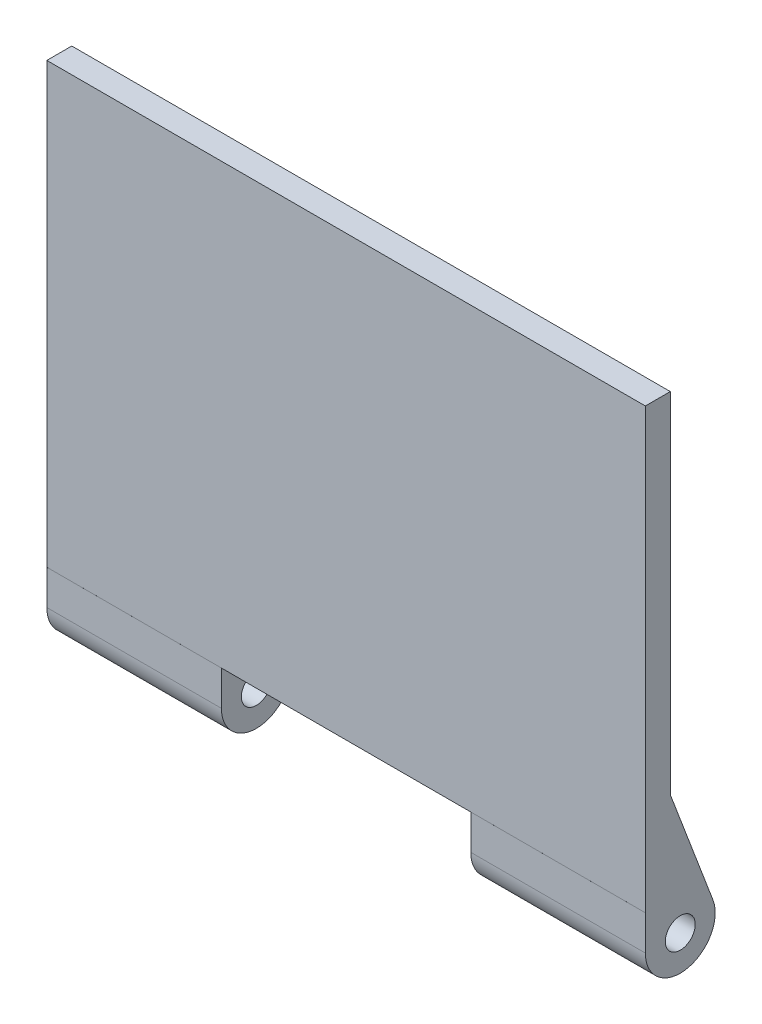
ISO-10303-21;
HEADER;
FILE_DESCRIPTION(('STEP AP214'),'2;1');
FILE_NAME('part.step','',(''),(''),'','','');
FILE_SCHEMA(('AUTOMOTIVE_DESIGN { 1 0 10303 214 1 1 1 1 }'));
ENDSEC;
DATA;
#1=APPLICATION_CONTEXT('core data for automotive mechanical design processes');
#2=APPLICATION_PROTOCOL_DEFINITION('international standard','automotive_design',2000,#1);
#3=PRODUCT_CONTEXT('',#1,'mechanical');
#4=PRODUCT('Part','Part','',(#3));
#5=PRODUCT_RELATED_PRODUCT_CATEGORY('part','',(#4));
#6=PRODUCT_DEFINITION_FORMATION('','',#4);
#7=PRODUCT_DEFINITION_CONTEXT('part definition',#1,'design');
#8=PRODUCT_DEFINITION('design','',#6,#7);
#9=PRODUCT_DEFINITION_SHAPE('','',#8);
#10=(LENGTH_UNIT() NAMED_UNIT(*) SI_UNIT(.MILLI.,.METRE.));
#11=(NAMED_UNIT(*) PLANE_ANGLE_UNIT() SI_UNIT($,.RADIAN.));
#12=(NAMED_UNIT(*) SI_UNIT($,.STERADIAN.) SOLID_ANGLE_UNIT());
#13=UNCERTAINTY_MEASURE_WITH_UNIT(LENGTH_MEASURE(1.E-05),#10,'distance_accuracy_value','');
#14=(GEOMETRIC_REPRESENTATION_CONTEXT(3) GLOBAL_UNCERTAINTY_ASSIGNED_CONTEXT((#13)) GLOBAL_UNIT_ASSIGNED_CONTEXT((#10,
#11,#12)) REPRESENTATION_CONTEXT('',''));
#15=CARTESIAN_POINT('',(0.,0.,0.));
#16=DIRECTION('',(0.,0.,1.));
#17=DIRECTION('',(1.,0.,0.));
#18=AXIS2_PLACEMENT_3D('',#15,#16,#17);
#19=CARTESIAN_POINT('',(-30.,-22.,2.5));
#20=DIRECTION('',(0.,1.,0.));
#21=DIRECTION('',(0.,0.,1.));
#22=AXIS2_PLACEMENT_3D('',#19,#20,#21);
#23=PLANE('',#22);
#24=DIRECTION('',(0.,0.,-1.));
#25=VECTOR('',#24,1.);
#26=CARTESIAN_POINT('',(-12.5,-22.,2.50055162199684));
#27=LINE('',#26,#25);
#28=CARTESIAN_POINT('',(-12.5,-22.,2.5));
#29=VERTEX_POINT('',#28);
#30=CARTESIAN_POINT('',(-12.5,-22.,0.));
#31=VERTEX_POINT('',#30);
#32=EDGE_CURVE('E202',#29,#31,#27,.T.);
#33=ORIENTED_EDGE('',*,*,#32,.T.);
#34=DIRECTION('',(1.,0.,0.));
#35=VECTOR('',#34,1.);
#36=CARTESIAN_POINT('',(-30.,-22.,0.));
#37=LINE('',#36,#35);
#38=CARTESIAN_POINT('',(12.5,-22.,0.));
#39=VERTEX_POINT('',#38);
#40=EDGE_CURVE('E103',#31,#39,#37,.T.);
#41=ORIENTED_EDGE('',*,*,#40,.T.);
#42=DIRECTION('',(0.,0.,1.));
#43=VECTOR('',#42,1.);
#44=CARTESIAN_POINT('',(12.5,-22.,0.));
#45=LINE('',#44,#43);
#46=CARTESIAN_POINT('',(12.5,-22.,2.5));
#47=VERTEX_POINT('',#46);
#48=EDGE_CURVE('E172',#39,#47,#45,.T.);
#49=ORIENTED_EDGE('',*,*,#48,.T.);
#50=DIRECTION('',(1.,0.,0.));
#51=VECTOR('',#50,1.);
#52=CARTESIAN_POINT('',(-30.,-22.,2.5));
#53=LINE('',#52,#51);
#54=EDGE_CURVE('E116',#29,#47,#53,.T.);
#55=ORIENTED_EDGE('',*,*,#54,.F.);
#56=EDGE_LOOP('',(#33,#41,#49,#55));
#57=FACE_BOUND('',#56,.T.);
#58=ADVANCED_FACE('F39',(#57),#23,.F.);
#59=CARTESIAN_POINT('',(30.,-22.,2.5));
#60=DIRECTION('',(-1.,0.,0.));
#61=DIRECTION('',(0.,0.,1.));
#62=AXIS2_PLACEMENT_3D('',#59,#60,#61);
#63=PLANE('',#62);
#64=DIRECTION('',(0.,1.,0.));
#65=VECTOR('',#64,1.);
#66=CARTESIAN_POINT('',(30.,-22.,2.5));
#67=LINE('',#66,#65);
#68=CARTESIAN_POINT('',(30.,-22.,2.5));
#69=VERTEX_POINT('',#68);
#70=CARTESIAN_POINT('',(30.,22.,2.5));
#71=VERTEX_POINT('',#70);
#72=EDGE_CURVE('E107',#69,#71,#67,.T.);
#73=ORIENTED_EDGE('',*,*,#72,.F.);
#74=DIRECTION('',(0.,0.,1.));
#75=VECTOR('',#74,1.);
#76=CARTESIAN_POINT('',(30.,-22.,0.));
#77=LINE('',#76,#75);
#78=CARTESIAN_POINT('',(30.,-22.,2.50055162199684));
#79=VERTEX_POINT('',#78);
#80=EDGE_CURVE('E152',#69,#79,#77,.T.);
#81=ORIENTED_EDGE('',*,*,#80,.T.);
#82=DIRECTION('',(0.,-1.,0.));
#83=VECTOR('',#82,1.);
#84=CARTESIAN_POINT('',(30.,-22.,2.50055162199684));
#85=LINE('',#84,#83);
#86=CARTESIAN_POINT('',(30.,-25.5,2.50055162199684));
#87=VERTEX_POINT('',#86);
#88=EDGE_CURVE('E148',#79,#87,#85,.T.);
#89=ORIENTED_EDGE('',*,*,#88,.T.);
#90=CARTESIAN_POINT('',(30.,-25.5,-0.999448378003161));
#91=DIRECTION('',(1.,0.,0.));
#92=DIRECTION('',(0.,0.,-1.));
#93=AXIS2_PLACEMENT_3D('',#90,#91,#92);
#94=CIRCLE('',#93,3.5);
#95=CARTESIAN_POINT('',(30.,-24.2583558546698,-4.27180529869002));
#96=VERTEX_POINT('',#95);
#97=EDGE_CURVE('E145',#87,#96,#94,.T.);
#98=ORIENTED_EDGE('',*,*,#97,.T.);
#99=DIRECTION('',(0.,0.934959120196244,0.354755470094352));
#100=VECTOR('',#99,1.);
#101=CARTESIAN_POINT('',(30.,-13.,0.));
#102=LINE('',#101,#100);
#103=CARTESIAN_POINT('',(30.,-13.,0.));
#104=VERTEX_POINT('',#103);
#105=EDGE_CURVE('E55',#96,#104,#102,.T.);
#106=ORIENTED_EDGE('',*,*,#105,.T.);
#107=DIRECTION('',(0.,1.,0.));
#108=VECTOR('',#107,1.);
#109=CARTESIAN_POINT('',(30.,-22.,0.));
#110=LINE('',#109,#108);
#111=CARTESIAN_POINT('',(30.,22.,0.));
#112=VERTEX_POINT('',#111);
#113=EDGE_CURVE('E85',#104,#112,#110,.T.);
#114=ORIENTED_EDGE('',*,*,#113,.T.);
#115=DIRECTION('',(0.,0.,-1.));
#116=VECTOR('',#115,1.);
#117=CARTESIAN_POINT('',(30.,22.,2.5));
#118=LINE('',#117,#116);
#119=EDGE_CURVE('E11',#71,#112,#118,.T.);
#120=ORIENTED_EDGE('',*,*,#119,.F.);
#121=EDGE_LOOP('',(#73,#81,#89,#98,#106,#114,#120));
#122=FACE_BOUND('',#121,.T.);
#123=CARTESIAN_POINT('',(30.,-25.5,-0.999448378003161));
#124=DIRECTION('',(1.,0.,0.));
#125=DIRECTION('',(0.,0.,-1.));
#126=AXIS2_PLACEMENT_3D('',#123,#124,#125);
#127=CIRCLE('',#126,1.5);
#128=CARTESIAN_POINT('',(30.,-25.5,-2.49944837800316));
#129=VERTEX_POINT('',#128);
#130=EDGE_CURVE('E176',#129,#129,#127,.T.);
#131=ORIENTED_EDGE('',*,*,#130,.F.);
#132=EDGE_LOOP('',(#131));
#133=FACE_BOUND('',#132,.T.);
#134=ADVANCED_FACE('F41',(#122,#133),#63,.F.);
#135=CARTESIAN_POINT('',(-30.,22.,2.5));
#136=DIRECTION('',(0.,-1.,0.));
#137=DIRECTION('',(0.,0.,-1.));
#138=AXIS2_PLACEMENT_3D('',#135,#136,#137);
#139=PLANE('',#138);
#140=DIRECTION('',(-1.,0.,0.));
#141=VECTOR('',#140,1.);
#142=CARTESIAN_POINT('',(-30.,22.,0.));
#143=LINE('',#142,#141);
#144=CARTESIAN_POINT('',(-30.,22.,0.));
#145=VERTEX_POINT('',#144);
#146=EDGE_CURVE('E75',#112,#145,#143,.T.);
#147=ORIENTED_EDGE('',*,*,#146,.T.);
#148=DIRECTION('',(0.,0.,-1.));
#149=VECTOR('',#148,1.);
#150=CARTESIAN_POINT('',(-30.,22.,2.5));
#151=LINE('',#150,#149);
#152=CARTESIAN_POINT('',(-30.,22.,2.5));
#153=VERTEX_POINT('',#152);
#154=EDGE_CURVE('E48',#153,#145,#151,.T.);
#155=ORIENTED_EDGE('',*,*,#154,.F.);
#156=DIRECTION('',(-1.,0.,0.));
#157=VECTOR('',#156,1.);
#158=CARTESIAN_POINT('',(-30.,22.,2.5));
#159=LINE('',#158,#157);
#160=EDGE_CURVE('E64',#71,#153,#159,.T.);
#161=ORIENTED_EDGE('',*,*,#160,.F.);
#162=ORIENTED_EDGE('',*,*,#119,.T.);
#163=EDGE_LOOP('',(#147,#155,#161,#162));
#164=FACE_BOUND('',#163,.T.);
#165=ADVANCED_FACE('F77',(#164),#139,.F.);
#166=CARTESIAN_POINT('',(-30.,-22.,2.5));
#167=DIRECTION('',(1.,0.,0.));
#168=DIRECTION('',(0.,0.,-1.));
#169=AXIS2_PLACEMENT_3D('',#166,#167,#168);
#170=PLANE('',#169);
#171=DIRECTION('',(0.,-1.,0.));
#172=VECTOR('',#171,1.);
#173=CARTESIAN_POINT('',(-30.,-22.,0.));
#174=LINE('',#173,#172);
#175=CARTESIAN_POINT('',(-30.,-13.,0.));
#176=VERTEX_POINT('',#175);
#177=EDGE_CURVE('E84',#145,#176,#174,.T.);
#178=ORIENTED_EDGE('',*,*,#177,.T.);
#179=DIRECTION('',(0.,-0.934959120196244,-0.354755470094352));
#180=VECTOR('',#179,1.);
#181=CARTESIAN_POINT('',(-30.,-13.,0.));
#182=LINE('',#181,#180);
#183=CARTESIAN_POINT('',(-30.,-24.2583558546698,-4.27180529869002));
#184=VERTEX_POINT('',#183);
#185=EDGE_CURVE('E207',#176,#184,#182,.T.);
#186=ORIENTED_EDGE('',*,*,#185,.T.);
#187=CARTESIAN_POINT('',(-30.,-25.5,-0.999448378003161));
#188=DIRECTION('',(-1.,0.,0.));
#189=DIRECTION('',(0.,0.,1.));
#190=AXIS2_PLACEMENT_3D('',#187,#188,#189);
#191=CIRCLE('',#190,3.5);
#192=CARTESIAN_POINT('',(-30.,-25.5,2.50055162199684));
#193=VERTEX_POINT('',#192);
#194=EDGE_CURVE('E203',#184,#193,#191,.T.);
#195=ORIENTED_EDGE('',*,*,#194,.T.);
#196=DIRECTION('',(0.,1.,0.));
#197=VECTOR('',#196,1.);
#198=CARTESIAN_POINT('',(-30.,-25.5,2.50055162199684));
#199=LINE('',#198,#197);
#200=CARTESIAN_POINT('',(-30.,-22.,2.50055162199684));
#201=VERTEX_POINT('',#200);
#202=EDGE_CURVE('E198',#193,#201,#199,.T.);
#203=ORIENTED_EDGE('',*,*,#202,.T.);
#204=DIRECTION('',(0.,0.,-1.));
#205=VECTOR('',#204,1.);
#206=CARTESIAN_POINT('',(-30.,-22.,2.5));
#207=LINE('',#206,#205);
#208=CARTESIAN_POINT('',(-30.,-22.,2.5));
#209=VERTEX_POINT('',#208);
#210=EDGE_CURVE('E210',#201,#209,#207,.T.);
#211=ORIENTED_EDGE('',*,*,#210,.T.);
#212=DIRECTION('',(0.,-1.,0.));
#213=VECTOR('',#212,1.);
#214=CARTESIAN_POINT('',(-30.,-22.,2.5));
#215=LINE('',#214,#213);
#216=EDGE_CURVE('E94',#153,#209,#215,.T.);
#217=ORIENTED_EDGE('',*,*,#216,.F.);
#218=ORIENTED_EDGE('',*,*,#154,.T.);
#219=EDGE_LOOP('',(#178,#186,#195,#203,#211,#217,#218));
#220=FACE_BOUND('',#219,.T.);
#221=CARTESIAN_POINT('',(-30.,-25.5,-0.999448378003161));
#222=DIRECTION('',(-1.,0.,0.));
#223=DIRECTION('',(0.,0.,1.));
#224=AXIS2_PLACEMENT_3D('',#221,#222,#223);
#225=CIRCLE('',#224,1.5);
#226=CARTESIAN_POINT('',(-30.,-25.5,0.50055162199684));
#227=VERTEX_POINT('',#226);
#228=EDGE_CURVE('E232',#227,#227,#225,.T.);
#229=ORIENTED_EDGE('',*,*,#228,.F.);
#230=EDGE_LOOP('',(#229));
#231=FACE_BOUND('',#230,.T.);
#232=ADVANCED_FACE('F89',(#220,#231),#170,.F.);
#233=CARTESIAN_POINT('',(0.,0.,2.5));
#234=DIRECTION('',(0.,0.,-1.));
#235=DIRECTION('',(-1.,0.,0.));
#236=AXIS2_PLACEMENT_3D('',#233,#234,#235);
#237=PLANE('',#236);
#238=ORIENTED_EDGE('',*,*,#72,.T.);
#239=ORIENTED_EDGE('',*,*,#160,.T.);
#240=ORIENTED_EDGE('',*,*,#216,.T.);
#241=EDGE_CURVE('E96',#209,#29,#53,.T.);
#242=ORIENTED_EDGE('',*,*,#241,.T.);
#243=ORIENTED_EDGE('',*,*,#54,.T.);
#244=DIRECTION('',(1.,0.,0.));
#245=VECTOR('',#244,1.);
#246=CARTESIAN_POINT('',(0.,-22.,2.5));
#247=LINE('',#246,#245);
#248=EDGE_CURVE('E112',#47,#69,#247,.T.);
#249=ORIENTED_EDGE('',*,*,#248,.T.);
#250=EDGE_LOOP('',(#238,#239,#240,#242,#243,#249));
#251=FACE_BOUND('',#250,.T.);
#252=ADVANCED_FACE('F249',(#251),#237,.F.);
#253=CARTESIAN_POINT('',(0.,0.,0.));
#254=DIRECTION('',(0.,0.,-1.));
#255=DIRECTION('',(-1.,0.,0.));
#256=AXIS2_PLACEMENT_3D('',#253,#254,#255);
#257=PLANE('',#256);
#258=DIRECTION('',(-1.,0.,0.));
#259=VECTOR('',#258,1.);
#260=CARTESIAN_POINT('',(-12.5,-13.,0.));
#261=LINE('',#260,#259);
#262=CARTESIAN_POINT('',(-12.5,-13.,0.));
#263=VERTEX_POINT('',#262);
#264=EDGE_CURVE('E101',#263,#176,#261,.T.);
#265=ORIENTED_EDGE('',*,*,#264,.T.);
#266=ORIENTED_EDGE('',*,*,#177,.F.);
#267=ORIENTED_EDGE('',*,*,#146,.F.);
#268=ORIENTED_EDGE('',*,*,#113,.F.);
#269=DIRECTION('',(1.,0.,0.));
#270=VECTOR('',#269,1.);
#271=CARTESIAN_POINT('',(12.5,-13.,0.));
#272=LINE('',#271,#270);
#273=CARTESIAN_POINT('',(12.5,-13.,0.));
#274=VERTEX_POINT('',#273);
#275=EDGE_CURVE('E126',#274,#104,#272,.T.);
#276=ORIENTED_EDGE('',*,*,#275,.F.);
#277=DIRECTION('',(0.,-1.,0.));
#278=VECTOR('',#277,1.);
#279=CARTESIAN_POINT('',(12.5,-22.,0.));
#280=LINE('',#279,#278);
#281=EDGE_CURVE('E132',#274,#39,#280,.T.);
#282=ORIENTED_EDGE('',*,*,#281,.T.);
#283=ORIENTED_EDGE('',*,*,#40,.F.);
#284=DIRECTION('',(0.,1.,0.));
#285=VECTOR('',#284,1.);
#286=CARTESIAN_POINT('',(-12.5,-22.,0.));
#287=LINE('',#286,#285);
#288=EDGE_CURVE('E225',#31,#263,#287,.T.);
#289=ORIENTED_EDGE('',*,*,#288,.T.);
#290=EDGE_LOOP('',(#265,#266,#267,#268,#276,#282,#283,#289));
#291=FACE_BOUND('',#290,.T.);
#292=ADVANCED_FACE('F98',(#291),#257,.T.);
#293=CARTESIAN_POINT('',(12.5,-22.,0.));
#294=DIRECTION('',(0.,1.,0.));
#295=DIRECTION('',(0.,0.,1.));
#296=AXIS2_PLACEMENT_3D('',#293,#294,#295);
#297=PLANE('',#296);
#298=ORIENTED_EDGE('',*,*,#248,.F.);
#299=CARTESIAN_POINT('',(12.5,-22.,2.50055162199684));
#300=VERTEX_POINT('',#299);
#301=EDGE_CURVE('E144',#47,#300,#45,.T.);
#302=ORIENTED_EDGE('',*,*,#301,.T.);
#303=DIRECTION('',(1.,0.,0.));
#304=VECTOR('',#303,1.);
#305=CARTESIAN_POINT('',(12.5,-22.,2.50055162199684));
#306=LINE('',#305,#304);
#307=EDGE_CURVE('E127',#300,#79,#306,.T.);
#308=ORIENTED_EDGE('',*,*,#307,.T.);
#309=ORIENTED_EDGE('',*,*,#80,.F.);
#310=EDGE_LOOP('',(#298,#302,#308,#309));
#311=FACE_BOUND('',#310,.T.);
#312=ADVANCED_FACE('F265',(#311),#297,.T.);
#313=CARTESIAN_POINT('',(12.5,-13.,0.));
#314=DIRECTION('',(0.,0.354755470094352,-0.934959120196244));
#315=DIRECTION('',(0.,0.934959120196244,0.354755470094352));
#316=AXIS2_PLACEMENT_3D('',#313,#314,#315);
#317=PLANE('',#316);
#318=ORIENTED_EDGE('',*,*,#105,.F.);
#319=DIRECTION('',(1.,0.,0.));
#320=VECTOR('',#319,1.);
#321=CARTESIAN_POINT('',(12.5,-24.2583558546698,-4.27180529869002));
#322=LINE('',#321,#320);
#323=CARTESIAN_POINT('',(12.5,-24.2583558546698,-4.27180529869002));
#324=VERTEX_POINT('',#323);
#325=EDGE_CURVE('E136',#324,#96,#322,.T.);
#326=ORIENTED_EDGE('',*,*,#325,.F.);
#327=DIRECTION('',(0.,0.934959120196244,0.354755470094352));
#328=VECTOR('',#327,1.);
#329=CARTESIAN_POINT('',(12.5,-13.,0.));
#330=LINE('',#329,#328);
#331=EDGE_CURVE('E160',#324,#274,#330,.T.);
#332=ORIENTED_EDGE('',*,*,#331,.T.);
#333=ORIENTED_EDGE('',*,*,#275,.T.);
#334=EDGE_LOOP('',(#318,#326,#332,#333));
#335=FACE_BOUND('',#334,.T.);
#336=ADVANCED_FACE('F269',(#335),#317,.T.);
#337=CARTESIAN_POINT('',(12.5,-25.5,-0.999448378003161));
#338=DIRECTION('',(1.,0.,0.));
#339=DIRECTION('',(0.,0.,-1.));
#340=AXIS2_PLACEMENT_3D('',#337,#338,#339);
#341=CYLINDRICAL_SURFACE('',#340,3.5);
#342=ORIENTED_EDGE('',*,*,#97,.F.);
#343=DIRECTION('',(1.,0.,0.));
#344=VECTOR('',#343,1.);
#345=CARTESIAN_POINT('',(12.5,-25.5,2.50055162199684));
#346=LINE('',#345,#344);
#347=CARTESIAN_POINT('',(12.5,-25.5,2.50055162199684));
#348=VERTEX_POINT('',#347);
#349=EDGE_CURVE('E131',#348,#87,#346,.T.);
#350=ORIENTED_EDGE('',*,*,#349,.F.);
#351=CARTESIAN_POINT('',(12.5,-25.5,-0.999448378003161));
#352=DIRECTION('',(1.,0.,0.));
#353=DIRECTION('',(0.,0.,-1.));
#354=AXIS2_PLACEMENT_3D('',#351,#352,#353);
#355=CIRCLE('',#354,3.5);
#356=EDGE_CURVE('E164',#348,#324,#355,.T.);
#357=ORIENTED_EDGE('',*,*,#356,.T.);
#358=ORIENTED_EDGE('',*,*,#325,.T.);
#359=EDGE_LOOP('',(#342,#350,#357,#358));
#360=FACE_BOUND('',#359,.T.);
#361=ADVANCED_FACE('F275',(#360),#341,.T.);
#362=CARTESIAN_POINT('',(12.5,-22.,2.50055162199684));
#363=DIRECTION('',(0.,0.,1.));
#364=DIRECTION('',(0.,-1.,0.));
#365=AXIS2_PLACEMENT_3D('',#362,#363,#364);
#366=PLANE('',#365);
#367=ORIENTED_EDGE('',*,*,#88,.F.);
#368=ORIENTED_EDGE('',*,*,#307,.F.);
#369=DIRECTION('',(0.,-1.,0.));
#370=VECTOR('',#369,1.);
#371=CARTESIAN_POINT('',(12.5,-22.,2.50055162199684));
#372=LINE('',#371,#370);
#373=EDGE_CURVE('E168',#300,#348,#372,.T.);
#374=ORIENTED_EDGE('',*,*,#373,.T.);
#375=ORIENTED_EDGE('',*,*,#349,.T.);
#376=EDGE_LOOP('',(#367,#368,#374,#375));
#377=FACE_BOUND('',#376,.T.);
#378=ADVANCED_FACE('F271',(#377),#366,.T.);
#379=CARTESIAN_POINT('',(12.5,-25.5,-0.999448378003161));
#380=DIRECTION('',(1.,0.,0.));
#381=DIRECTION('',(0.,0.,-1.));
#382=AXIS2_PLACEMENT_3D('',#379,#380,#381);
#383=PLANE('',#382);
#384=CARTESIAN_POINT('',(12.5,-25.5,-0.999448378003161));
#385=DIRECTION('',(1.,0.,0.));
#386=DIRECTION('',(0.,0.,-1.));
#387=AXIS2_PLACEMENT_3D('',#384,#385,#386);
#388=CIRCLE('',#387,1.5);
#389=CARTESIAN_POINT('',(12.5,-25.5,-2.49944837800316));
#390=VERTEX_POINT('',#389);
#391=EDGE_CURVE('E156',#390,#390,#388,.T.);
#392=ORIENTED_EDGE('',*,*,#391,.T.);
#393=EDGE_LOOP('',(#392));
#394=FACE_BOUND('',#393,.T.);
#395=ORIENTED_EDGE('',*,*,#48,.F.);
#396=ORIENTED_EDGE('',*,*,#281,.F.);
#397=ORIENTED_EDGE('',*,*,#331,.F.);
#398=ORIENTED_EDGE('',*,*,#356,.F.);
#399=ORIENTED_EDGE('',*,*,#373,.F.);
#400=ORIENTED_EDGE('',*,*,#301,.F.);
#401=EDGE_LOOP('',(#395,#396,#397,#398,#399,#400));
#402=FACE_BOUND('',#401,.T.);
#403=ADVANCED_FACE('F274',(#394,#402),#383,.F.);
#404=CARTESIAN_POINT('',(12.5,-25.5,-0.999448378003161));
#405=DIRECTION('',(1.,0.,0.));
#406=DIRECTION('',(0.,0.,-1.));
#407=AXIS2_PLACEMENT_3D('',#404,#405,#406);
#408=CYLINDRICAL_SURFACE('',#407,1.5);
#409=ORIENTED_EDGE('',*,*,#391,.F.);
#410=EDGE_LOOP('',(#409));
#411=FACE_BOUND('',#410,.T.);
#412=ORIENTED_EDGE('',*,*,#130,.T.);
#413=EDGE_LOOP('',(#412));
#414=FACE_BOUND('',#413,.T.);
#415=ADVANCED_FACE('F285',(#411,#414),#408,.F.);
#416=CARTESIAN_POINT('',(-12.5,-22.,2.5));
#417=DIRECTION('',(0.,1.,0.));
#418=DIRECTION('',(0.,0.,1.));
#419=AXIS2_PLACEMENT_3D('',#416,#417,#418);
#420=PLANE('',#419);
#421=ORIENTED_EDGE('',*,*,#241,.F.);
#422=ORIENTED_EDGE('',*,*,#210,.F.);
#423=DIRECTION('',(-1.,0.,0.));
#424=VECTOR('',#423,1.);
#425=CARTESIAN_POINT('',(-12.5,-22.,2.50055162199684));
#426=LINE('',#425,#424);
#427=CARTESIAN_POINT('',(-12.5,-22.,2.50055162199684));
#428=VERTEX_POINT('',#427);
#429=EDGE_CURVE('E180',#428,#201,#426,.T.);
#430=ORIENTED_EDGE('',*,*,#429,.F.);
#431=EDGE_CURVE('E228',#428,#29,#27,.T.);
#432=ORIENTED_EDGE('',*,*,#431,.T.);
#433=EDGE_LOOP('',(#421,#422,#430,#432));
#434=FACE_BOUND('',#433,.T.);
#435=ADVANCED_FACE('F289',(#434),#420,.T.);
#436=CARTESIAN_POINT('',(-12.5,-25.5,2.50055162199684));
#437=DIRECTION('',(0.,0.,1.));
#438=DIRECTION('',(0.,-1.,0.));
#439=AXIS2_PLACEMENT_3D('',#436,#437,#438);
#440=PLANE('',#439);
#441=ORIENTED_EDGE('',*,*,#202,.F.);
#442=DIRECTION('',(-1.,0.,0.));
#443=VECTOR('',#442,1.);
#444=CARTESIAN_POINT('',(-12.5,-25.5,2.50055162199684));
#445=LINE('',#444,#443);
#446=CARTESIAN_POINT('',(-12.5,-25.5,2.50055162199684));
#447=VERTEX_POINT('',#446);
#448=EDGE_CURVE('E191',#447,#193,#445,.T.);
#449=ORIENTED_EDGE('',*,*,#448,.F.);
#450=DIRECTION('',(0.,1.,0.));
#451=VECTOR('',#450,1.);
#452=CARTESIAN_POINT('',(-12.5,-25.5,2.50055162199684));
#453=LINE('',#452,#451);
#454=EDGE_CURVE('E187',#447,#428,#453,.T.);
#455=ORIENTED_EDGE('',*,*,#454,.T.);
#456=ORIENTED_EDGE('',*,*,#429,.T.);
#457=EDGE_LOOP('',(#441,#449,#455,#456));
#458=FACE_BOUND('',#457,.T.);
#459=ADVANCED_FACE('F293',(#458),#440,.T.);
#460=CARTESIAN_POINT('',(-12.5,-25.5,-0.999448378003161));
#461=DIRECTION('',(-1.,0.,0.));
#462=DIRECTION('',(0.,0.,1.));
#463=AXIS2_PLACEMENT_3D('',#460,#461,#462);
#464=CYLINDRICAL_SURFACE('',#463,3.5);
#465=ORIENTED_EDGE('',*,*,#194,.F.);
#466=DIRECTION('',(-1.,0.,0.));
#467=VECTOR('',#466,1.);
#468=CARTESIAN_POINT('',(-12.5,-24.2583558546698,-4.27180529869002));
#469=LINE('',#468,#467);
#470=CARTESIAN_POINT('',(-12.5,-24.2583558546698,-4.27180529869002));
#471=VERTEX_POINT('',#470);
#472=EDGE_CURVE('E186',#471,#184,#469,.T.);
#473=ORIENTED_EDGE('',*,*,#472,.F.);
#474=CARTESIAN_POINT('',(-12.5,-25.5,-0.999448378003161));
#475=DIRECTION('',(-1.,0.,0.));
#476=DIRECTION('',(0.,0.,1.));
#477=AXIS2_PLACEMENT_3D('',#474,#475,#476);
#478=CIRCLE('',#477,3.5);
#479=EDGE_CURVE('E217',#471,#447,#478,.T.);
#480=ORIENTED_EDGE('',*,*,#479,.T.);
#481=ORIENTED_EDGE('',*,*,#448,.T.);
#482=EDGE_LOOP('',(#465,#473,#480,#481));
#483=FACE_BOUND('',#482,.T.);
#484=ADVANCED_FACE('F298',(#483),#464,.T.);
#485=CARTESIAN_POINT('',(-12.5,-13.,0.));
#486=DIRECTION('',(0.,0.354755470094352,-0.934959120196244));
#487=DIRECTION('',(0.,0.934959120196244,0.354755470094352));
#488=AXIS2_PLACEMENT_3D('',#485,#486,#487);
#489=PLANE('',#488);
#490=ORIENTED_EDGE('',*,*,#185,.F.);
#491=ORIENTED_EDGE('',*,*,#264,.F.);
#492=DIRECTION('',(0.,-0.934959120196244,-0.354755470094352));
#493=VECTOR('',#492,1.);
#494=CARTESIAN_POINT('',(-12.5,-13.,0.));
#495=LINE('',#494,#493);
#496=EDGE_CURVE('E221',#263,#471,#495,.T.);
#497=ORIENTED_EDGE('',*,*,#496,.T.);
#498=ORIENTED_EDGE('',*,*,#472,.T.);
#499=EDGE_LOOP('',(#490,#491,#497,#498));
#500=FACE_BOUND('',#499,.T.);
#501=ADVANCED_FACE('F295',(#500),#489,.T.);
#502=CARTESIAN_POINT('',(-12.5,-25.5,-0.999448378003161));
#503=DIRECTION('',(-1.,0.,0.));
#504=DIRECTION('',(0.,0.,1.));
#505=AXIS2_PLACEMENT_3D('',#502,#503,#504);
#506=PLANE('',#505);
#507=CARTESIAN_POINT('',(-12.5,-25.5,-0.999448378003161));
#508=DIRECTION('',(-1.,0.,0.));
#509=DIRECTION('',(0.,0.,1.));
#510=AXIS2_PLACEMENT_3D('',#507,#508,#509);
#511=CIRCLE('',#510,1.5);
#512=CARTESIAN_POINT('',(-12.5,-25.5,0.50055162199684));
#513=VERTEX_POINT('',#512);
#514=EDGE_CURVE('E213',#513,#513,#511,.T.);
#515=ORIENTED_EDGE('',*,*,#514,.T.);
#516=EDGE_LOOP('',(#515));
#517=FACE_BOUND('',#516,.T.);
#518=ORIENTED_EDGE('',*,*,#431,.F.);
#519=ORIENTED_EDGE('',*,*,#454,.F.);
#520=ORIENTED_EDGE('',*,*,#479,.F.);
#521=ORIENTED_EDGE('',*,*,#496,.F.);
#522=ORIENTED_EDGE('',*,*,#288,.F.);
#523=ORIENTED_EDGE('',*,*,#32,.F.);
#524=EDGE_LOOP('',(#518,#519,#520,#521,#522,#523));
#525=FACE_BOUND('',#524,.T.);
#526=ADVANCED_FACE('F240',(#517,#525),#506,.F.);
#527=CARTESIAN_POINT('',(-12.5,-25.5,-0.999448378003161));
#528=DIRECTION('',(-1.,0.,0.));
#529=DIRECTION('',(0.,0.,1.));
#530=AXIS2_PLACEMENT_3D('',#527,#528,#529);
#531=CYLINDRICAL_SURFACE('',#530,1.5);
#532=ORIENTED_EDGE('',*,*,#514,.F.);
#533=EDGE_LOOP('',(#532));
#534=FACE_BOUND('',#533,.T.);
#535=ORIENTED_EDGE('',*,*,#228,.T.);
#536=EDGE_LOOP('',(#535));
#537=FACE_BOUND('',#536,.T.);
#538=ADVANCED_FACE('F243',(#534,#537),#531,.F.);
#539=CLOSED_SHELL('',(#58,#134,#165,#232,#252,#292,#312,#336,#361,#378,#403,#415,#435,#459,#484,
#501,#526,#538));
#540=MANIFOLD_SOLID_BREP('B2',#539);
#541=ADVANCED_BREP_SHAPE_REPRESENTATION('',(#18,#540),#14);
#542=SHAPE_DEFINITION_REPRESENTATION(#9,#541);
ENDSEC;
END-ISO-10303-21;
